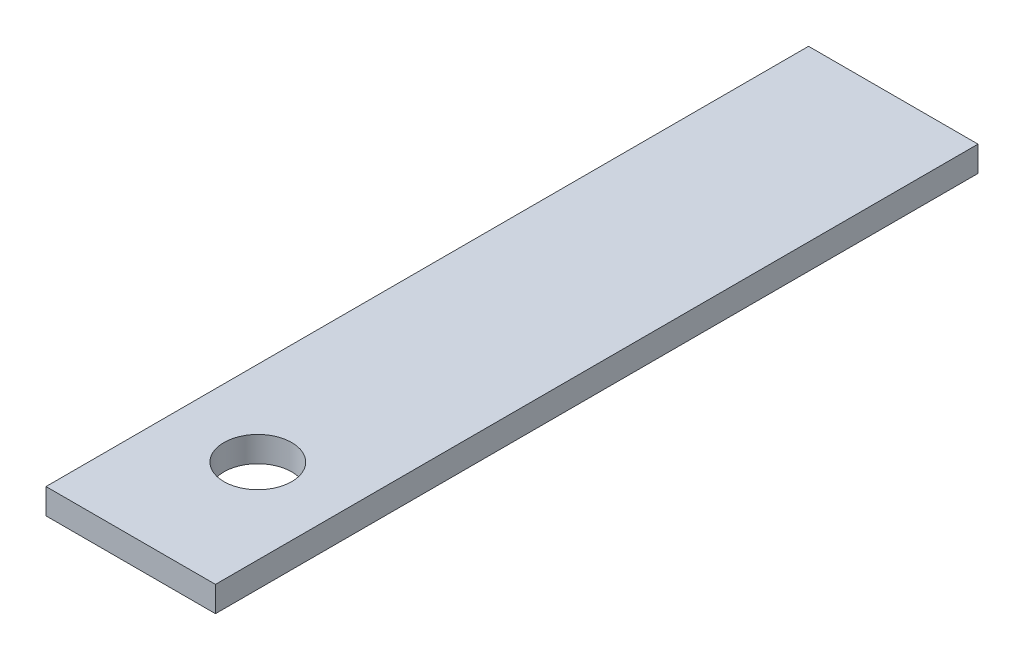
ISO-10303-21;
HEADER;
FILE_DESCRIPTION(('STEP AP214'),'2;1');
FILE_NAME('part.step','',(''),(''),'','','');
FILE_SCHEMA(('AUTOMOTIVE_DESIGN { 1 0 10303 214 1 1 1 1 }'));
ENDSEC;
DATA;
#1=APPLICATION_CONTEXT('core data for automotive mechanical design processes');
#2=APPLICATION_PROTOCOL_DEFINITION('international standard','automotive_design',2000,#1);
#3=PRODUCT_CONTEXT('',#1,'mechanical');
#4=PRODUCT('Part','Part','',(#3));
#5=PRODUCT_RELATED_PRODUCT_CATEGORY('part','',(#4));
#6=PRODUCT_DEFINITION_FORMATION('','',#4);
#7=PRODUCT_DEFINITION_CONTEXT('part definition',#1,'design');
#8=PRODUCT_DEFINITION('design','',#6,#7);
#9=PRODUCT_DEFINITION_SHAPE('','',#8);
#10=(LENGTH_UNIT() NAMED_UNIT(*) SI_UNIT(.MILLI.,.METRE.));
#11=(NAMED_UNIT(*) PLANE_ANGLE_UNIT() SI_UNIT($,.RADIAN.));
#12=(NAMED_UNIT(*) SI_UNIT($,.STERADIAN.) SOLID_ANGLE_UNIT());
#13=UNCERTAINTY_MEASURE_WITH_UNIT(LENGTH_MEASURE(1.E-05),#10,'distance_accuracy_value','');
#14=(GEOMETRIC_REPRESENTATION_CONTEXT(3) GLOBAL_UNCERTAINTY_ASSIGNED_CONTEXT((#13)) GLOBAL_UNIT_ASSIGNED_CONTEXT((#10,
#11,#12)) REPRESENTATION_CONTEXT('',''));
#15=CARTESIAN_POINT('',(0.,0.,0.));
#16=DIRECTION('',(0.,0.,1.));
#17=DIRECTION('',(1.,0.,0.));
#18=AXIS2_PLACEMENT_3D('',#15,#16,#17);
#19=CARTESIAN_POINT('',(-10.,3.,0.));
#20=DIRECTION('',(1.,0.,0.));
#21=DIRECTION('',(0.,0.,-1.));
#22=AXIS2_PLACEMENT_3D('',#19,#20,#21);
#23=PLANE('',#22);
#24=DIRECTION('',(0.,0.,1.));
#25=VECTOR('',#24,1.);
#26=CARTESIAN_POINT('',(-10.,0.,0.));
#27=LINE('',#26,#25);
#28=CARTESIAN_POINT('',(-10.,0.,-45.));
#29=VERTEX_POINT('',#28);
#30=CARTESIAN_POINT('',(-10.,0.,45.));
#31=VERTEX_POINT('',#30);
#32=EDGE_CURVE('E112',#29,#31,#27,.T.);
#33=ORIENTED_EDGE('',*,*,#32,.T.);
#34=DIRECTION('',(0.,-1.,0.));
#35=VECTOR('',#34,1.);
#36=CARTESIAN_POINT('',(-10.,3.,45.));
#37=LINE('',#36,#35);
#38=CARTESIAN_POINT('',(-10.,3.,45.));
#39=VERTEX_POINT('',#38);
#40=EDGE_CURVE('E11',#39,#31,#37,.T.);
#41=ORIENTED_EDGE('',*,*,#40,.F.);
#42=DIRECTION('',(0.,0.,1.));
#43=VECTOR('',#42,1.);
#44=CARTESIAN_POINT('',(-10.,3.,0.));
#45=LINE('',#44,#43);
#46=CARTESIAN_POINT('',(-10.,3.,-45.));
#47=VERTEX_POINT('',#46);
#48=EDGE_CURVE('E90',#47,#39,#45,.T.);
#49=ORIENTED_EDGE('',*,*,#48,.F.);
#50=DIRECTION('',(0.,-1.,0.));
#51=VECTOR('',#50,1.);
#52=CARTESIAN_POINT('',(-10.,3.,-45.));
#53=LINE('',#52,#51);
#54=EDGE_CURVE('E57',#47,#29,#53,.T.);
#55=ORIENTED_EDGE('',*,*,#54,.T.);
#56=EDGE_LOOP('',(#33,#41,#49,#55));
#57=FACE_BOUND('',#56,.T.);
#58=ADVANCED_FACE('F39',(#57),#23,.F.);
#59=CARTESIAN_POINT('',(0.,3.,45.));
#60=DIRECTION('',(0.,0.,-1.));
#61=DIRECTION('',(-1.,0.,0.));
#62=AXIS2_PLACEMENT_3D('',#59,#60,#61);
#63=PLANE('',#62);
#64=DIRECTION('',(1.,0.,0.));
#65=VECTOR('',#64,1.);
#66=CARTESIAN_POINT('',(0.,0.,45.));
#67=LINE('',#66,#65);
#68=CARTESIAN_POINT('',(10.,0.,45.));
#69=VERTEX_POINT('',#68);
#70=EDGE_CURVE('E96',#31,#69,#67,.T.);
#71=ORIENTED_EDGE('',*,*,#70,.T.);
#72=DIRECTION('',(0.,-1.,0.));
#73=VECTOR('',#72,1.);
#74=CARTESIAN_POINT('',(10.,3.,45.));
#75=LINE('',#74,#73);
#76=CARTESIAN_POINT('',(10.,3.,45.));
#77=VERTEX_POINT('',#76);
#78=EDGE_CURVE('E49',#77,#69,#75,.T.);
#79=ORIENTED_EDGE('',*,*,#78,.F.);
#80=DIRECTION('',(1.,0.,0.));
#81=VECTOR('',#80,1.);
#82=CARTESIAN_POINT('',(0.,3.,45.));
#83=LINE('',#82,#81);
#84=EDGE_CURVE('E82',#39,#77,#83,.T.);
#85=ORIENTED_EDGE('',*,*,#84,.F.);
#86=ORIENTED_EDGE('',*,*,#40,.T.);
#87=EDGE_LOOP('',(#71,#79,#85,#86));
#88=FACE_BOUND('',#87,.T.);
#89=ADVANCED_FACE('F95',(#88),#63,.F.);
#90=CARTESIAN_POINT('',(10.,3.,0.));
#91=DIRECTION('',(1.,0.,0.));
#92=DIRECTION('',(0.,0.,-1.));
#93=AXIS2_PLACEMENT_3D('',#90,#91,#92);
#94=PLANE('',#93);
#95=DIRECTION('',(0.,0.,1.));
#96=VECTOR('',#95,1.);
#97=CARTESIAN_POINT('',(10.,0.,0.));
#98=LINE('',#97,#96);
#99=CARTESIAN_POINT('',(10.,0.,-45.));
#100=VERTEX_POINT('',#99);
#101=EDGE_CURVE('E117',#100,#69,#98,.T.);
#102=ORIENTED_EDGE('',*,*,#101,.F.);
#103=DIRECTION('',(0.,-1.,0.));
#104=VECTOR('',#103,1.);
#105=CARTESIAN_POINT('',(10.,3.,-45.));
#106=LINE('',#105,#104);
#107=CARTESIAN_POINT('',(10.,3.,-45.));
#108=VERTEX_POINT('',#107);
#109=EDGE_CURVE('E71',#108,#100,#106,.T.);
#110=ORIENTED_EDGE('',*,*,#109,.F.);
#111=DIRECTION('',(0.,0.,1.));
#112=VECTOR('',#111,1.);
#113=CARTESIAN_POINT('',(10.,3.,0.));
#114=LINE('',#113,#112);
#115=EDGE_CURVE('E89',#108,#77,#114,.T.);
#116=ORIENTED_EDGE('',*,*,#115,.T.);
#117=ORIENTED_EDGE('',*,*,#78,.T.);
#118=EDGE_LOOP('',(#102,#110,#116,#117));
#119=FACE_BOUND('',#118,.T.);
#120=ADVANCED_FACE('F100',(#119),#94,.T.);
#121=CARTESIAN_POINT('',(0.,3.,30.));
#122=DIRECTION('',(0.,-1.,0.));
#123=DIRECTION('',(0.,0.,-1.));
#124=AXIS2_PLACEMENT_3D('',#121,#122,#123);
#125=CYLINDRICAL_SURFACE('',#124,4.);
#126=CARTESIAN_POINT('',(0.,3.,30.));
#127=DIRECTION('',(0.,1.,0.));
#128=DIRECTION('',(0.,0.,1.));
#129=AXIS2_PLACEMENT_3D('',#126,#127,#128);
#130=CIRCLE('',#129,4.);
#131=CARTESIAN_POINT('',(0.,3.,34.));
#132=VERTEX_POINT('',#131);
#133=EDGE_CURVE('E124',#132,#132,#130,.T.);
#134=ORIENTED_EDGE('',*,*,#133,.T.);
#135=EDGE_LOOP('',(#134));
#136=FACE_BOUND('',#135,.T.);
#137=CARTESIAN_POINT('',(0.,0.,30.));
#138=DIRECTION('',(0.,1.,0.));
#139=DIRECTION('',(0.,0.,1.));
#140=AXIS2_PLACEMENT_3D('',#137,#138,#139);
#141=CIRCLE('',#140,4.);
#142=CARTESIAN_POINT('',(0.,0.,34.));
#143=VERTEX_POINT('',#142);
#144=EDGE_CURVE('E108',#143,#143,#141,.T.);
#145=ORIENTED_EDGE('',*,*,#144,.F.);
#146=EDGE_LOOP('',(#145));
#147=FACE_BOUND('',#146,.T.);
#148=ADVANCED_FACE('F41',(#136,#147),#125,.F.);
#149=CARTESIAN_POINT('',(0.,3.,-45.));
#150=DIRECTION('',(0.,0.,-1.));
#151=DIRECTION('',(-1.,0.,0.));
#152=AXIS2_PLACEMENT_3D('',#149,#150,#151);
#153=PLANE('',#152);
#154=DIRECTION('',(1.,0.,0.));
#155=VECTOR('',#154,1.);
#156=CARTESIAN_POINT('',(0.,0.,-45.));
#157=LINE('',#156,#155);
#158=EDGE_CURVE('E120',#29,#100,#157,.T.);
#159=ORIENTED_EDGE('',*,*,#158,.F.);
#160=ORIENTED_EDGE('',*,*,#54,.F.);
#161=DIRECTION('',(1.,0.,0.));
#162=VECTOR('',#161,1.);
#163=CARTESIAN_POINT('',(0.,3.,-45.));
#164=LINE('',#163,#162);
#165=EDGE_CURVE('E102',#47,#108,#164,.T.);
#166=ORIENTED_EDGE('',*,*,#165,.T.);
#167=ORIENTED_EDGE('',*,*,#109,.T.);
#168=EDGE_LOOP('',(#159,#160,#166,#167));
#169=FACE_BOUND('',#168,.T.);
#170=ADVANCED_FACE('F139',(#169),#153,.T.);
#171=CARTESIAN_POINT('',(0.,3.,0.));
#172=DIRECTION('',(0.,1.,0.));
#173=DIRECTION('',(0.,0.,1.));
#174=AXIS2_PLACEMENT_3D('',#171,#172,#173);
#175=PLANE('',#174);
#176=ORIENTED_EDGE('',*,*,#133,.F.);
#177=EDGE_LOOP('',(#176));
#178=FACE_BOUND('',#177,.T.);
#179=ORIENTED_EDGE('',*,*,#48,.T.);
#180=ORIENTED_EDGE('',*,*,#84,.T.);
#181=ORIENTED_EDGE('',*,*,#115,.F.);
#182=ORIENTED_EDGE('',*,*,#165,.F.);
#183=EDGE_LOOP('',(#179,#180,#181,#182));
#184=FACE_BOUND('',#183,.T.);
#185=ADVANCED_FACE('F86',(#178,#184),#175,.T.);
#186=CARTESIAN_POINT('',(0.,0.,0.));
#187=DIRECTION('',(0.,1.,0.));
#188=DIRECTION('',(0.,0.,1.));
#189=AXIS2_PLACEMENT_3D('',#186,#187,#188);
#190=PLANE('',#189);
#191=ORIENTED_EDGE('',*,*,#144,.T.);
#192=EDGE_LOOP('',(#191));
#193=FACE_BOUND('',#192,.T.);
#194=ORIENTED_EDGE('',*,*,#32,.F.);
#195=ORIENTED_EDGE('',*,*,#158,.T.);
#196=ORIENTED_EDGE('',*,*,#101,.T.);
#197=ORIENTED_EDGE('',*,*,#70,.F.);
#198=EDGE_LOOP('',(#194,#195,#196,#197));
#199=FACE_BOUND('',#198,.T.);
#200=ADVANCED_FACE('F138',(#193,#199),#190,.F.);
#201=CLOSED_SHELL('',(#58,#89,#120,#148,#170,#185,#200));
#202=MANIFOLD_SOLID_BREP('B2',#201);
#203=ADVANCED_BREP_SHAPE_REPRESENTATION('',(#18,#202),#14);
#204=SHAPE_DEFINITION_REPRESENTATION(#9,#203);
ENDSEC;
END-ISO-10303-21;
